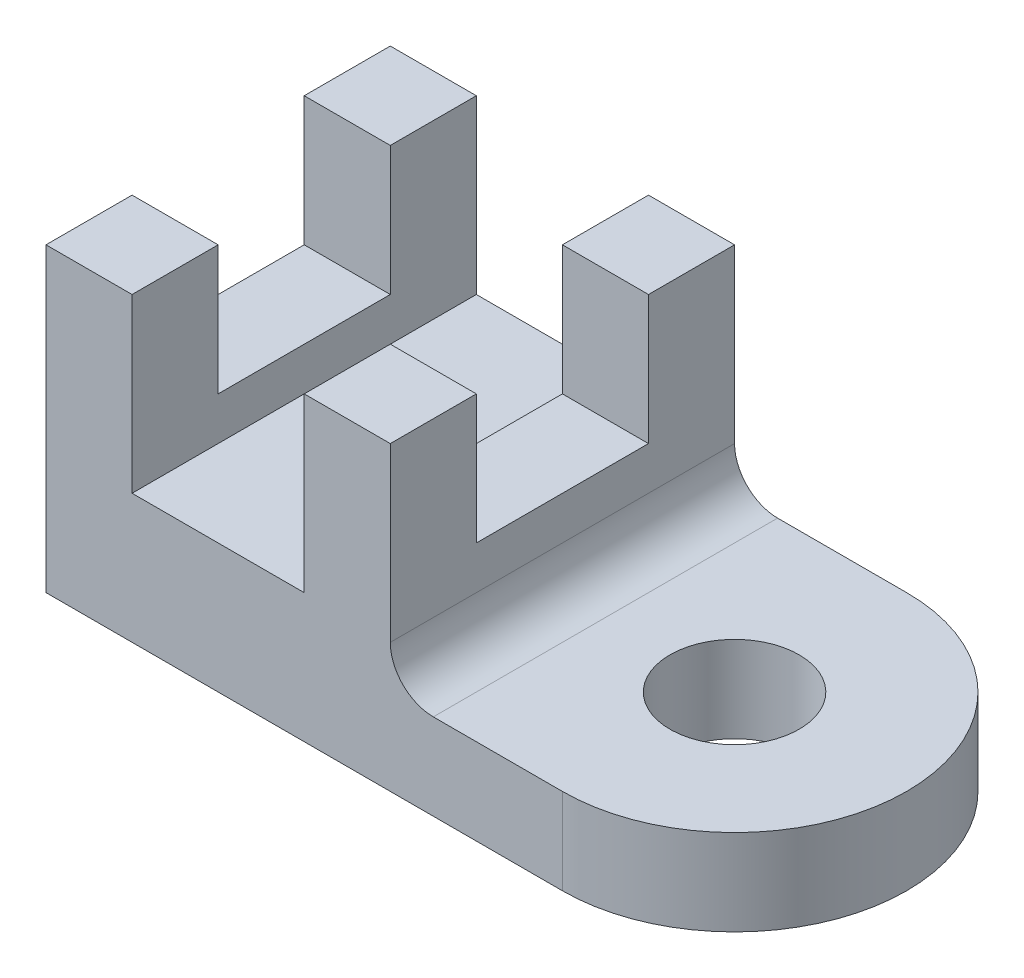
ISO-10303-21;
HEADER;
FILE_DESCRIPTION(('STEP AP214'),'2;1');
FILE_NAME('part.step','',(''),(''),'','','');
FILE_SCHEMA(('AUTOMOTIVE_DESIGN { 1 0 10303 214 1 1 1 1 }'));
ENDSEC;
DATA;
#1=APPLICATION_CONTEXT('core data for automotive mechanical design processes');
#2=APPLICATION_PROTOCOL_DEFINITION('international standard','automotive_design',2000,#1);
#3=PRODUCT_CONTEXT('',#1,'mechanical');
#4=PRODUCT('Part','Part','',(#3));
#5=PRODUCT_RELATED_PRODUCT_CATEGORY('part','',(#4));
#6=PRODUCT_DEFINITION_FORMATION('','',#4);
#7=PRODUCT_DEFINITION_CONTEXT('part definition',#1,'design');
#8=PRODUCT_DEFINITION('design','',#6,#7);
#9=PRODUCT_DEFINITION_SHAPE('','',#8);
#10=(LENGTH_UNIT() NAMED_UNIT(*) SI_UNIT(.MILLI.,.METRE.));
#11=(NAMED_UNIT(*) PLANE_ANGLE_UNIT() SI_UNIT($,.RADIAN.));
#12=(NAMED_UNIT(*) SI_UNIT($,.STERADIAN.) SOLID_ANGLE_UNIT());
#13=UNCERTAINTY_MEASURE_WITH_UNIT(LENGTH_MEASURE(1.E-05),#10,'distance_accuracy_value','');
#14=(GEOMETRIC_REPRESENTATION_CONTEXT(3) GLOBAL_UNCERTAINTY_ASSIGNED_CONTEXT((#13)) GLOBAL_UNIT_ASSIGNED_CONTEXT((#10,
#11,#12)) REPRESENTATION_CONTEXT('',''));
#15=CARTESIAN_POINT('',(0.,0.,0.));
#16=DIRECTION('',(0.,0.,1.));
#17=DIRECTION('',(1.,0.,0.));
#18=AXIS2_PLACEMENT_3D('',#15,#16,#17);
#19=CARTESIAN_POINT('',(50.8,44.45,25.4));
#20=DIRECTION('',(0.,-1.,0.));
#21=DIRECTION('',(1.,0.,0.));
#22=AXIS2_PLACEMENT_3D('',#19,#20,#21);
#23=PLANE('',#22);
#24=DIRECTION('',(0.,0.,-1.));
#25=VECTOR('',#24,1.);
#26=CARTESIAN_POINT('',(50.8,44.45,25.4));
#27=LINE('',#26,#25);
#28=CARTESIAN_POINT('',(50.8,44.45,25.4));
#29=VERTEX_POINT('',#28);
#30=CARTESIAN_POINT('',(50.8,44.45,12.7));
#31=VERTEX_POINT('',#30);
#32=EDGE_CURVE('E301',#29,#31,#27,.T.);
#33=ORIENTED_EDGE('',*,*,#32,.T.);
#34=DIRECTION('',(1.,0.,0.));
#35=VECTOR('',#34,1.);
#36=CARTESIAN_POINT('',(0.,44.45,12.7));
#37=LINE('',#36,#35);
#38=CARTESIAN_POINT('',(38.1,44.45,12.7));
#39=VERTEX_POINT('',#38);
#40=EDGE_CURVE('E208',#39,#31,#37,.T.);
#41=ORIENTED_EDGE('',*,*,#40,.F.);
#42=DIRECTION('',(0.,0.,-1.));
#43=VECTOR('',#42,1.);
#44=CARTESIAN_POINT('',(38.1,44.45,25.4));
#45=LINE('',#44,#43);
#46=CARTESIAN_POINT('',(38.1,44.45,25.4));
#47=VERTEX_POINT('',#46);
#48=EDGE_CURVE('E297',#47,#39,#45,.T.);
#49=ORIENTED_EDGE('',*,*,#48,.F.);
#50=DIRECTION('',(-1.,0.,0.));
#51=VECTOR('',#50,1.);
#52=CARTESIAN_POINT('',(50.8,44.45,25.4));
#53=LINE('',#52,#51);
#54=EDGE_CURVE('E251',#29,#47,#53,.T.);
#55=ORIENTED_EDGE('',*,*,#54,.F.);
#56=EDGE_LOOP('',(#33,#41,#49,#55));
#57=FACE_BOUND('',#56,.T.);
#58=ADVANCED_FACE('F37',(#57),#23,.F.);
#59=CARTESIAN_POINT('',(12.7,44.45,25.4));
#60=DIRECTION('',(0.,-1.,0.));
#61=DIRECTION('',(0.,0.,-1.));
#62=AXIS2_PLACEMENT_3D('',#59,#60,#61);
#63=PLANE('',#62);
#64=DIRECTION('',(0.,0.,-1.));
#65=VECTOR('',#64,1.);
#66=CARTESIAN_POINT('',(12.7,44.45,25.4));
#67=LINE('',#66,#65);
#68=CARTESIAN_POINT('',(12.7,44.45,25.4));
#69=VERTEX_POINT('',#68);
#70=CARTESIAN_POINT('',(12.7,44.45,12.7));
#71=VERTEX_POINT('',#70);
#72=EDGE_CURVE('E287',#69,#71,#67,.T.);
#73=ORIENTED_EDGE('',*,*,#72,.T.);
#74=CARTESIAN_POINT('',(0.,44.45,12.7));
#75=VERTEX_POINT('',#74);
#76=EDGE_CURVE('E205',#75,#71,#37,.T.);
#77=ORIENTED_EDGE('',*,*,#76,.F.);
#78=DIRECTION('',(0.,0.,-1.));
#79=VECTOR('',#78,1.);
#80=CARTESIAN_POINT('',(0.,44.45,25.4));
#81=LINE('',#80,#79);
#82=CARTESIAN_POINT('',(0.,44.45,25.4));
#83=VERTEX_POINT('',#82);
#84=EDGE_CURVE('E193',#83,#75,#81,.T.);
#85=ORIENTED_EDGE('',*,*,#84,.F.);
#86=DIRECTION('',(-1.,0.,0.));
#87=VECTOR('',#86,1.);
#88=CARTESIAN_POINT('',(12.7,44.45,25.4));
#89=LINE('',#88,#87);
#90=EDGE_CURVE('E259',#69,#83,#89,.T.);
#91=ORIENTED_EDGE('',*,*,#90,.F.);
#92=EDGE_LOOP('',(#73,#77,#85,#91));
#93=FACE_BOUND('',#92,.T.);
#94=ADVANCED_FACE('F356',(#93),#63,.F.);
#95=CARTESIAN_POINT('',(0.,44.45,25.4));
#96=DIRECTION('',(1.,0.,0.));
#97=DIRECTION('',(0.,1.,0.));
#98=AXIS2_PLACEMENT_3D('',#95,#96,#97);
#99=PLANE('',#98);
#100=ORIENTED_EDGE('',*,*,#84,.T.);
#101=DIRECTION('',(0.,-1.,0.));
#102=VECTOR('',#101,1.);
#103=CARTESIAN_POINT('',(0.,44.45,12.7));
#104=LINE('',#103,#102);
#105=CARTESIAN_POINT('',(0.,25.4,12.7));
#106=VERTEX_POINT('',#105);
#107=EDGE_CURVE('E170',#75,#106,#104,.T.);
#108=ORIENTED_EDGE('',*,*,#107,.T.);
#109=DIRECTION('',(0.,0.,-1.));
#110=VECTOR('',#109,1.);
#111=CARTESIAN_POINT('',(0.,25.4,12.7));
#112=LINE('',#111,#110);
#113=CARTESIAN_POINT('',(0.,25.4,-12.7));
#114=VERTEX_POINT('',#113);
#115=EDGE_CURVE('E180',#106,#114,#112,.T.);
#116=ORIENTED_EDGE('',*,*,#115,.T.);
#117=DIRECTION('',(0.,1.,0.));
#118=VECTOR('',#117,1.);
#119=CARTESIAN_POINT('',(0.,44.45,-12.7));
#120=LINE('',#119,#118);
#121=CARTESIAN_POINT('',(0.,44.45,-12.7));
#122=VERTEX_POINT('',#121);
#123=EDGE_CURVE('E187',#114,#122,#120,.T.);
#124=ORIENTED_EDGE('',*,*,#123,.T.);
#125=CARTESIAN_POINT('',(0.,44.45,-25.4));
#126=VERTEX_POINT('',#125);
#127=EDGE_CURVE('E261',#122,#126,#81,.T.);
#128=ORIENTED_EDGE('',*,*,#127,.T.);
#129=DIRECTION('',(0.,-1.,0.));
#130=VECTOR('',#129,1.);
#131=CARTESIAN_POINT('',(0.,44.45,-25.4));
#132=LINE('',#131,#130);
#133=CARTESIAN_POINT('',(0.,0.,-25.4));
#134=VERTEX_POINT('',#133);
#135=EDGE_CURVE('E238',#126,#134,#132,.T.);
#136=ORIENTED_EDGE('',*,*,#135,.T.);
#137=DIRECTION('',(0.,0.,-1.));
#138=VECTOR('',#137,1.);
#139=CARTESIAN_POINT('',(0.,0.,25.4));
#140=LINE('',#139,#138);
#141=CARTESIAN_POINT('',(0.,0.,25.4));
#142=VERTEX_POINT('',#141);
#143=EDGE_CURVE('E304',#142,#134,#140,.T.);
#144=ORIENTED_EDGE('',*,*,#143,.F.);
#145=DIRECTION('',(0.,-1.,0.));
#146=VECTOR('',#145,1.);
#147=CARTESIAN_POINT('',(0.,44.45,25.4));
#148=LINE('',#147,#146);
#149=EDGE_CURVE('E239',#83,#142,#148,.T.);
#150=ORIENTED_EDGE('',*,*,#149,.F.);
#151=EDGE_LOOP('',(#100,#108,#116,#124,#128,#136,#144,#150));
#152=FACE_BOUND('',#151,.T.);
#153=ADVANCED_FACE('F190',(#152),#99,.F.);
#154=CARTESIAN_POINT('',(0.,0.,25.4));
#155=DIRECTION('',(0.,1.,0.));
#156=DIRECTION('',(0.,0.,1.));
#157=AXIS2_PLACEMENT_3D('',#154,#155,#156);
#158=PLANE('',#157);
#159=CARTESIAN_POINT('',(76.2,0.,0.));
#160=DIRECTION('',(0.,1.,0.));
#161=DIRECTION('',(-1.,0.,0.));
#162=AXIS2_PLACEMENT_3D('',#159,#160,#161);
#163=CIRCLE('',#162,9.52500000000001);
#164=CARTESIAN_POINT('',(66.675,0.,0.));
#165=VERTEX_POINT('',#164);
#166=EDGE_CURVE('E227',#165,#165,#163,.T.);
#167=ORIENTED_EDGE('',*,*,#166,.T.);
#168=EDGE_LOOP('',(#167));
#169=FACE_BOUND('',#168,.T.);
#170=DIRECTION('',(1.,0.,0.));
#171=VECTOR('',#170,1.);
#172=CARTESIAN_POINT('',(0.,0.,-25.4));
#173=LINE('',#172,#171);
#174=CARTESIAN_POINT('',(76.2,0.,-25.4));
#175=VERTEX_POINT('',#174);
#176=EDGE_CURVE('E264',#134,#175,#173,.T.);
#177=ORIENTED_EDGE('',*,*,#176,.T.);
#178=CARTESIAN_POINT('',(76.2,0.,0.));
#179=DIRECTION('',(0.,-1.,0.));
#180=DIRECTION('',(0.,0.,-1.));
#181=AXIS2_PLACEMENT_3D('',#178,#179,#180);
#182=CIRCLE('',#181,25.4);
#183=CARTESIAN_POINT('',(76.2,0.,25.4));
#184=VERTEX_POINT('',#183);
#185=EDGE_CURVE('E230',#175,#184,#182,.T.);
#186=ORIENTED_EDGE('',*,*,#185,.T.);
#187=DIRECTION('',(1.,0.,0.));
#188=VECTOR('',#187,1.);
#189=CARTESIAN_POINT('',(0.,0.,25.4));
#190=LINE('',#189,#188);
#191=EDGE_CURVE('E242',#142,#184,#190,.T.);
#192=ORIENTED_EDGE('',*,*,#191,.F.);
#193=ORIENTED_EDGE('',*,*,#143,.T.);
#194=EDGE_LOOP('',(#177,#186,#192,#193));
#195=FACE_BOUND('',#194,.T.);
#196=ADVANCED_FACE('F378',(#169,#195),#158,.F.);
#197=CARTESIAN_POINT('',(76.2,12.7,25.4));
#198=DIRECTION('',(0.,-1.,0.));
#199=DIRECTION('',(1.,0.,0.));
#200=AXIS2_PLACEMENT_3D('',#197,#198,#199);
#201=PLANE('',#200);
#202=CARTESIAN_POINT('',(76.2,12.7,0.));
#203=DIRECTION('',(0.,1.,0.));
#204=DIRECTION('',(-1.,0.,0.));
#205=AXIS2_PLACEMENT_3D('',#202,#203,#204);
#206=CIRCLE('',#205,9.52500000000001);
#207=CARTESIAN_POINT('',(66.675,12.7,0.));
#208=VERTEX_POINT('',#207);
#209=EDGE_CURVE('E226',#208,#208,#206,.T.);
#210=ORIENTED_EDGE('',*,*,#209,.F.);
#211=EDGE_LOOP('',(#210));
#212=FACE_BOUND('',#211,.T.);
#213=DIRECTION('',(-1.,0.,0.));
#214=VECTOR('',#213,1.);
#215=CARTESIAN_POINT('',(76.2,12.7,-25.4));
#216=LINE('',#215,#214);
#217=CARTESIAN_POINT('',(76.2,12.7,-25.4));
#218=VERTEX_POINT('',#217);
#219=CARTESIAN_POINT('',(57.15,12.7,-25.4));
#220=VERTEX_POINT('',#219);
#221=EDGE_CURVE('E269',#218,#220,#216,.T.);
#222=ORIENTED_EDGE('',*,*,#221,.T.);
#223=DIRECTION('',(0.,0.,-1.));
#224=VECTOR('',#223,1.);
#225=CARTESIAN_POINT('',(57.15,12.7,25.4));
#226=LINE('',#225,#224);
#227=CARTESIAN_POINT('',(57.15,12.7,25.4));
#228=VERTEX_POINT('',#227);
#229=EDGE_CURVE('E52',#220,#228,#226,.F.);
#230=ORIENTED_EDGE('',*,*,#229,.T.);
#231=DIRECTION('',(-1.,0.,0.));
#232=VECTOR('',#231,1.);
#233=CARTESIAN_POINT('',(76.2,12.7,25.4));
#234=LINE('',#233,#232);
#235=CARTESIAN_POINT('',(76.2,12.7,25.4));
#236=VERTEX_POINT('',#235);
#237=EDGE_CURVE('E247',#236,#228,#234,.T.);
#238=ORIENTED_EDGE('',*,*,#237,.F.);
#239=CARTESIAN_POINT('',(76.2,12.7,0.));
#240=DIRECTION('',(0.,-1.,0.));
#241=DIRECTION('',(1.,0.,0.));
#242=AXIS2_PLACEMENT_3D('',#239,#240,#241);
#243=CIRCLE('',#242,25.4);
#244=EDGE_CURVE('E235',#236,#218,#243,.F.);
#245=ORIENTED_EDGE('',*,*,#244,.T.);
#246=EDGE_LOOP('',(#222,#230,#238,#245));
#247=FACE_BOUND('',#246,.T.);
#248=ADVANCED_FACE('F374',(#212,#247),#201,.F.);
#249=CARTESIAN_POINT('',(50.8,12.7,25.4));
#250=DIRECTION('',(-1.,0.,0.));
#251=DIRECTION('',(0.,0.,1.));
#252=AXIS2_PLACEMENT_3D('',#249,#250,#251);
#253=PLANE('',#252);
#254=DIRECTION('',(0.,1.,0.));
#255=VECTOR('',#254,1.);
#256=CARTESIAN_POINT('',(50.8,12.7,25.4));
#257=LINE('',#256,#255);
#258=CARTESIAN_POINT('',(50.8,19.05,25.4));
#259=VERTEX_POINT('',#258);
#260=EDGE_CURVE('E249',#259,#29,#257,.T.);
#261=ORIENTED_EDGE('',*,*,#260,.F.);
#262=DIRECTION('',(0.,0.,-1.));
#263=VECTOR('',#262,1.);
#264=CARTESIAN_POINT('',(50.8,19.05,-25.4));
#265=LINE('',#264,#263);
#266=CARTESIAN_POINT('',(50.8,19.05,-25.4));
#267=VERTEX_POINT('',#266);
#268=EDGE_CURVE('E309',#259,#267,#265,.T.);
#269=ORIENTED_EDGE('',*,*,#268,.T.);
#270=DIRECTION('',(0.,1.,0.));
#271=VECTOR('',#270,1.);
#272=CARTESIAN_POINT('',(50.8,12.7,-25.4));
#273=LINE('',#272,#271);
#274=CARTESIAN_POINT('',(50.8,44.45,-25.4));
#275=VERTEX_POINT('',#274);
#276=EDGE_CURVE('E271',#267,#275,#273,.T.);
#277=ORIENTED_EDGE('',*,*,#276,.T.);
#278=CARTESIAN_POINT('',(50.8,44.45,-12.7));
#279=VERTEX_POINT('',#278);
#280=EDGE_CURVE('E300',#279,#275,#27,.T.);
#281=ORIENTED_EDGE('',*,*,#280,.F.);
#282=DIRECTION('',(0.,1.,0.));
#283=VECTOR('',#282,1.);
#284=CARTESIAN_POINT('',(50.8,44.45,-12.7));
#285=LINE('',#284,#283);
#286=CARTESIAN_POINT('',(50.8,25.4,-12.7));
#287=VERTEX_POINT('',#286);
#288=EDGE_CURVE('E194',#287,#279,#285,.T.);
#289=ORIENTED_EDGE('',*,*,#288,.F.);
#290=DIRECTION('',(0.,0.,-1.));
#291=VECTOR('',#290,1.);
#292=CARTESIAN_POINT('',(50.8,25.4,12.7));
#293=LINE('',#292,#291);
#294=CARTESIAN_POINT('',(50.8,25.4,12.7));
#295=VERTEX_POINT('',#294);
#296=EDGE_CURVE('E196',#295,#287,#293,.T.);
#297=ORIENTED_EDGE('',*,*,#296,.F.);
#298=DIRECTION('',(0.,-1.,0.));
#299=VECTOR('',#298,1.);
#300=CARTESIAN_POINT('',(50.8,44.45,12.7));
#301=LINE('',#300,#299);
#302=EDGE_CURVE('E200',#31,#295,#301,.T.);
#303=ORIENTED_EDGE('',*,*,#302,.F.);
#304=ORIENTED_EDGE('',*,*,#32,.F.);
#305=EDGE_LOOP('',(#261,#269,#277,#281,#289,#297,#303,#304));
#306=FACE_BOUND('',#305,.T.);
#307=ADVANCED_FACE('F315',(#306),#253,.F.);
#308=CARTESIAN_POINT('',(38.1,44.45,-12.7));
#309=VERTEX_POINT('',#308);
#310=CARTESIAN_POINT('',(38.1,44.45,-25.4));
#311=VERTEX_POINT('',#310);
#312=EDGE_CURVE('E296',#309,#311,#45,.T.);
#313=ORIENTED_EDGE('',*,*,#312,.F.);
#314=DIRECTION('',(1.,0.,0.));
#315=VECTOR('',#314,1.);
#316=CARTESIAN_POINT('',(0.,44.45,-12.7));
#317=LINE('',#316,#315);
#318=EDGE_CURVE('E212',#309,#279,#317,.T.);
#319=ORIENTED_EDGE('',*,*,#318,.T.);
#320=ORIENTED_EDGE('',*,*,#280,.T.);
#321=DIRECTION('',(-1.,0.,0.));
#322=VECTOR('',#321,1.);
#323=CARTESIAN_POINT('',(50.8,44.45,-25.4));
#324=LINE('',#323,#322);
#325=EDGE_CURVE('E273',#275,#311,#324,.T.);
#326=ORIENTED_EDGE('',*,*,#325,.T.);
#327=EDGE_LOOP('',(#313,#319,#320,#326));
#328=FACE_BOUND('',#327,.T.);
#329=ADVANCED_FACE('F328',(#328),#23,.F.);
#330=CARTESIAN_POINT('',(38.1,44.45,25.4));
#331=DIRECTION('',(1.,0.,0.));
#332=DIRECTION('',(0.,0.,-1.));
#333=AXIS2_PLACEMENT_3D('',#330,#331,#332);
#334=PLANE('',#333);
#335=ORIENTED_EDGE('',*,*,#48,.T.);
#336=DIRECTION('',(0.,-1.,0.));
#337=VECTOR('',#336,1.);
#338=CARTESIAN_POINT('',(38.1,44.45,12.7));
#339=LINE('',#338,#337);
#340=CARTESIAN_POINT('',(38.1,25.4,12.7));
#341=VERTEX_POINT('',#340);
#342=EDGE_CURVE('E220',#39,#341,#339,.T.);
#343=ORIENTED_EDGE('',*,*,#342,.T.);
#344=DIRECTION('',(0.,0.,-1.));
#345=VECTOR('',#344,1.);
#346=CARTESIAN_POINT('',(38.1,25.4,25.4));
#347=LINE('',#346,#345);
#348=CARTESIAN_POINT('',(38.1,25.4,-12.7));
#349=VERTEX_POINT('',#348);
#350=EDGE_CURVE('E223',#341,#349,#347,.T.);
#351=ORIENTED_EDGE('',*,*,#350,.T.);
#352=DIRECTION('',(0.,1.,0.));
#353=VECTOR('',#352,1.);
#354=CARTESIAN_POINT('',(38.1,44.45,-12.7));
#355=LINE('',#354,#353);
#356=EDGE_CURVE('E216',#349,#309,#355,.T.);
#357=ORIENTED_EDGE('',*,*,#356,.T.);
#358=ORIENTED_EDGE('',*,*,#312,.T.);
#359=DIRECTION('',(0.,-1.,0.));
#360=VECTOR('',#359,1.);
#361=CARTESIAN_POINT('',(38.1,44.45,-25.4));
#362=LINE('',#361,#360);
#363=CARTESIAN_POINT('',(38.1,19.05,-25.4));
#364=VERTEX_POINT('',#363);
#365=EDGE_CURVE('E276',#311,#364,#362,.T.);
#366=ORIENTED_EDGE('',*,*,#365,.T.);
#367=DIRECTION('',(0.,0.,-1.));
#368=VECTOR('',#367,1.);
#369=CARTESIAN_POINT('',(38.1,19.05,25.4));
#370=LINE('',#369,#368);
#371=CARTESIAN_POINT('',(38.1,19.05,25.4));
#372=VERTEX_POINT('',#371);
#373=EDGE_CURVE('E293',#372,#364,#370,.T.);
#374=ORIENTED_EDGE('',*,*,#373,.F.);
#375=DIRECTION('',(0.,-1.,0.));
#376=VECTOR('',#375,1.);
#377=CARTESIAN_POINT('',(38.1,44.45,25.4));
#378=LINE('',#377,#376);
#379=EDGE_CURVE('E253',#47,#372,#378,.T.);
#380=ORIENTED_EDGE('',*,*,#379,.F.);
#381=EDGE_LOOP('',(#335,#343,#351,#357,#358,#366,#374,#380));
#382=FACE_BOUND('',#381,.T.);
#383=ADVANCED_FACE('F367',(#382),#334,.F.);
#384=CARTESIAN_POINT('',(38.1,19.05,25.4));
#385=DIRECTION('',(0.,-1.,0.));
#386=DIRECTION('',(1.,0.,0.));
#387=AXIS2_PLACEMENT_3D('',#384,#385,#386);
#388=PLANE('',#387);
#389=DIRECTION('',(-1.,0.,0.));
#390=VECTOR('',#389,1.);
#391=CARTESIAN_POINT('',(38.1,19.05,-25.4));
#392=LINE('',#391,#390);
#393=CARTESIAN_POINT('',(12.7,19.05,-25.4));
#394=VERTEX_POINT('',#393);
#395=EDGE_CURVE('E278',#364,#394,#392,.T.);
#396=ORIENTED_EDGE('',*,*,#395,.T.);
#397=DIRECTION('',(0.,0.,-1.));
#398=VECTOR('',#397,1.);
#399=CARTESIAN_POINT('',(12.7,19.05,25.4));
#400=LINE('',#399,#398);
#401=CARTESIAN_POINT('',(12.7,19.05,25.4));
#402=VERTEX_POINT('',#401);
#403=EDGE_CURVE('E290',#402,#394,#400,.T.);
#404=ORIENTED_EDGE('',*,*,#403,.F.);
#405=DIRECTION('',(-1.,0.,0.));
#406=VECTOR('',#405,1.);
#407=CARTESIAN_POINT('',(38.1,19.05,25.4));
#408=LINE('',#407,#406);
#409=EDGE_CURVE('E255',#372,#402,#408,.T.);
#410=ORIENTED_EDGE('',*,*,#409,.F.);
#411=ORIENTED_EDGE('',*,*,#373,.T.);
#412=EDGE_LOOP('',(#396,#404,#410,#411));
#413=FACE_BOUND('',#412,.T.);
#414=ADVANCED_FACE('F372',(#413),#388,.F.);
#415=CARTESIAN_POINT('',(12.7,19.05,25.4));
#416=DIRECTION('',(-1.,0.,0.));
#417=DIRECTION('',(0.,0.,1.));
#418=AXIS2_PLACEMENT_3D('',#415,#416,#417);
#419=PLANE('',#418);
#420=DIRECTION('',(0.,0.,1.));
#421=VECTOR('',#420,1.);
#422=CARTESIAN_POINT('',(12.7,25.4,25.4));
#423=LINE('',#422,#421);
#424=CARTESIAN_POINT('',(12.7,25.4,-12.7));
#425=VERTEX_POINT('',#424);
#426=CARTESIAN_POINT('',(12.7,25.4,12.7));
#427=VERTEX_POINT('',#426);
#428=EDGE_CURVE('E307',#425,#427,#423,.T.);
#429=ORIENTED_EDGE('',*,*,#428,.T.);
#430=DIRECTION('',(0.,1.,0.));
#431=VECTOR('',#430,1.);
#432=CARTESIAN_POINT('',(12.7,19.05,12.7));
#433=LINE('',#432,#431);
#434=EDGE_CURVE('E173',#427,#71,#433,.T.);
#435=ORIENTED_EDGE('',*,*,#434,.T.);
#436=ORIENTED_EDGE('',*,*,#72,.F.);
#437=DIRECTION('',(0.,1.,0.));
#438=VECTOR('',#437,1.);
#439=CARTESIAN_POINT('',(12.7,19.05,25.4));
#440=LINE('',#439,#438);
#441=EDGE_CURVE('E257',#402,#69,#440,.T.);
#442=ORIENTED_EDGE('',*,*,#441,.F.);
#443=ORIENTED_EDGE('',*,*,#403,.T.);
#444=DIRECTION('',(0.,1.,0.));
#445=VECTOR('',#444,1.);
#446=CARTESIAN_POINT('',(12.7,19.05,-25.4));
#447=LINE('',#446,#445);
#448=CARTESIAN_POINT('',(12.7,44.45,-25.4));
#449=VERTEX_POINT('',#448);
#450=EDGE_CURVE('E280',#394,#449,#447,.T.);
#451=ORIENTED_EDGE('',*,*,#450,.T.);
#452=CARTESIAN_POINT('',(12.7,44.45,-12.7));
#453=VERTEX_POINT('',#452);
#454=EDGE_CURVE('E286',#453,#449,#67,.T.);
#455=ORIENTED_EDGE('',*,*,#454,.F.);
#456=DIRECTION('',(0.,-1.,0.));
#457=VECTOR('',#456,1.);
#458=CARTESIAN_POINT('',(12.7,19.05,-12.7));
#459=LINE('',#458,#457);
#460=EDGE_CURVE('E207',#453,#425,#459,.T.);
#461=ORIENTED_EDGE('',*,*,#460,.T.);
#462=EDGE_LOOP('',(#429,#435,#436,#442,#443,#451,#455,#461));
#463=FACE_BOUND('',#462,.T.);
#464=ADVANCED_FACE('F499',(#463),#419,.F.);
#465=ORIENTED_EDGE('',*,*,#127,.F.);
#466=EDGE_CURVE('E209',#122,#453,#317,.T.);
#467=ORIENTED_EDGE('',*,*,#466,.T.);
#468=ORIENTED_EDGE('',*,*,#454,.T.);
#469=DIRECTION('',(-1.,0.,0.));
#470=VECTOR('',#469,1.);
#471=CARTESIAN_POINT('',(12.7,44.45,-25.4));
#472=LINE('',#471,#470);
#473=EDGE_CURVE('E243',#449,#126,#472,.T.);
#474=ORIENTED_EDGE('',*,*,#473,.T.);
#475=EDGE_LOOP('',(#465,#467,#468,#474));
#476=FACE_BOUND('',#475,.T.);
#477=ADVANCED_FACE('F363',(#476),#63,.F.);
#478=CARTESIAN_POINT('',(0.,0.,25.4));
#479=DIRECTION('',(0.,0.,1.));
#480=DIRECTION('',(1.,0.,0.));
#481=AXIS2_PLACEMENT_3D('',#478,#479,#480);
#482=PLANE('',#481);
#483=ORIENTED_EDGE('',*,*,#149,.T.);
#484=ORIENTED_EDGE('',*,*,#191,.T.);
#485=DIRECTION('',(0.,1.,0.));
#486=VECTOR('',#485,1.);
#487=CARTESIAN_POINT('',(76.2,0.,25.4));
#488=LINE('',#487,#486);
#489=EDGE_CURVE('E245',#184,#236,#488,.T.);
#490=ORIENTED_EDGE('',*,*,#489,.T.);
#491=ORIENTED_EDGE('',*,*,#237,.T.);
#492=CARTESIAN_POINT('',(57.15,19.05,25.4));
#493=DIRECTION('',(0.,0.,1.));
#494=DIRECTION('',(1.,0.,0.));
#495=AXIS2_PLACEMENT_3D('',#492,#493,#494);
#496=CIRCLE('',#495,6.35);
#497=EDGE_CURVE('E11',#228,#259,#496,.F.);
#498=ORIENTED_EDGE('',*,*,#497,.T.);
#499=ORIENTED_EDGE('',*,*,#260,.T.);
#500=ORIENTED_EDGE('',*,*,#54,.T.);
#501=ORIENTED_EDGE('',*,*,#379,.T.);
#502=ORIENTED_EDGE('',*,*,#409,.T.);
#503=ORIENTED_EDGE('',*,*,#441,.T.);
#504=ORIENTED_EDGE('',*,*,#90,.T.);
#505=EDGE_LOOP('',(#483,#484,#490,#491,#498,#499,#500,#501,#502,#503,#504));
#506=FACE_BOUND('',#505,.T.);
#507=ADVANCED_FACE('F347',(#506),#482,.T.);
#508=CARTESIAN_POINT('',(0.,0.,-25.4));
#509=DIRECTION('',(0.,0.,1.));
#510=DIRECTION('',(1.,0.,0.));
#511=AXIS2_PLACEMENT_3D('',#508,#509,#510);
#512=PLANE('',#511);
#513=ORIENTED_EDGE('',*,*,#135,.F.);
#514=ORIENTED_EDGE('',*,*,#473,.F.);
#515=ORIENTED_EDGE('',*,*,#450,.F.);
#516=ORIENTED_EDGE('',*,*,#395,.F.);
#517=ORIENTED_EDGE('',*,*,#365,.F.);
#518=ORIENTED_EDGE('',*,*,#325,.F.);
#519=ORIENTED_EDGE('',*,*,#276,.F.);
#520=CARTESIAN_POINT('',(57.15,19.05,-25.4));
#521=DIRECTION('',(0.,0.,1.));
#522=DIRECTION('',(1.,0.,0.));
#523=AXIS2_PLACEMENT_3D('',#520,#521,#522);
#524=CIRCLE('',#523,6.35);
#525=EDGE_CURVE('E45',#267,#220,#524,.T.);
#526=ORIENTED_EDGE('',*,*,#525,.T.);
#527=ORIENTED_EDGE('',*,*,#221,.F.);
#528=DIRECTION('',(0.,1.,0.));
#529=VECTOR('',#528,1.);
#530=CARTESIAN_POINT('',(76.2,0.,-25.4));
#531=LINE('',#530,#529);
#532=EDGE_CURVE('E266',#175,#218,#531,.T.);
#533=ORIENTED_EDGE('',*,*,#532,.F.);
#534=ORIENTED_EDGE('',*,*,#176,.F.);
#535=EDGE_LOOP('',(#513,#514,#515,#516,#517,#518,#519,#526,#527,#533,#534));
#536=FACE_BOUND('',#535,.T.);
#537=ADVANCED_FACE('F323',(#536),#512,.F.);
#538=CARTESIAN_POINT('',(76.2,84.5420489685532,0.));
#539=DIRECTION('',(0.,-1.,0.));
#540=DIRECTION('',(0.,0.,-1.));
#541=AXIS2_PLACEMENT_3D('',#538,#539,#540);
#542=CYLINDRICAL_SURFACE('',#541,25.4);
#543=ORIENTED_EDGE('',*,*,#244,.F.);
#544=ORIENTED_EDGE('',*,*,#489,.F.);
#545=ORIENTED_EDGE('',*,*,#185,.F.);
#546=ORIENTED_EDGE('',*,*,#532,.T.);
#547=EDGE_LOOP('',(#543,#544,#545,#546));
#548=FACE_BOUND('',#547,.T.);
#549=ADVANCED_FACE('F428',(#548),#542,.T.);
#550=CARTESIAN_POINT('',(76.2,0.,0.));
#551=DIRECTION('',(0.,1.,0.));
#552=DIRECTION('',(-1.,0.,0.));
#553=AXIS2_PLACEMENT_3D('',#550,#551,#552);
#554=CYLINDRICAL_SURFACE('',#553,9.52500000000001);
#555=ORIENTED_EDGE('',*,*,#166,.F.);
#556=EDGE_LOOP('',(#555));
#557=FACE_BOUND('',#556,.T.);
#558=ORIENTED_EDGE('',*,*,#209,.T.);
#559=EDGE_LOOP('',(#558));
#560=FACE_BOUND('',#559,.T.);
#561=ADVANCED_FACE('F472',(#557,#560),#554,.F.);
#562=CARTESIAN_POINT('',(0.,44.45,12.7));
#563=DIRECTION('',(0.,0.,1.));
#564=DIRECTION('',(0.,-1.,0.));
#565=AXIS2_PLACEMENT_3D('',#562,#563,#564);
#566=PLANE('',#565);
#567=DIRECTION('',(1.,0.,0.));
#568=VECTOR('',#567,1.);
#569=CARTESIAN_POINT('',(0.,25.4,12.7));
#570=LINE('',#569,#568);
#571=EDGE_CURVE('E166',#106,#427,#570,.T.);
#572=ORIENTED_EDGE('',*,*,#571,.F.);
#573=ORIENTED_EDGE('',*,*,#107,.F.);
#574=ORIENTED_EDGE('',*,*,#76,.T.);
#575=ORIENTED_EDGE('',*,*,#434,.F.);
#576=EDGE_LOOP('',(#572,#573,#574,#575));
#577=FACE_BOUND('',#576,.T.);
#578=ADVANCED_FACE('F168',(#577),#566,.F.);
#579=CARTESIAN_POINT('',(0.,44.45,-12.7));
#580=DIRECTION('',(0.,0.,-1.));
#581=DIRECTION('',(0.,1.,0.));
#582=AXIS2_PLACEMENT_3D('',#579,#580,#581);
#583=PLANE('',#582);
#584=ORIENTED_EDGE('',*,*,#466,.F.);
#585=ORIENTED_EDGE('',*,*,#123,.F.);
#586=DIRECTION('',(1.,0.,0.));
#587=VECTOR('',#586,1.);
#588=CARTESIAN_POINT('',(0.,25.4,-12.7));
#589=LINE('',#588,#587);
#590=EDGE_CURVE('E183',#114,#425,#589,.T.);
#591=ORIENTED_EDGE('',*,*,#590,.T.);
#592=ORIENTED_EDGE('',*,*,#460,.F.);
#593=EDGE_LOOP('',(#584,#585,#591,#592));
#594=FACE_BOUND('',#593,.T.);
#595=ADVANCED_FACE('F354',(#594),#583,.F.);
#596=CARTESIAN_POINT('',(0.,25.4,12.7));
#597=DIRECTION('',(0.,-1.,0.));
#598=DIRECTION('',(0.,0.,-1.));
#599=AXIS2_PLACEMENT_3D('',#596,#597,#598);
#600=PLANE('',#599);
#601=ORIENTED_EDGE('',*,*,#590,.F.);
#602=ORIENTED_EDGE('',*,*,#115,.F.);
#603=ORIENTED_EDGE('',*,*,#571,.T.);
#604=ORIENTED_EDGE('',*,*,#428,.F.);
#605=EDGE_LOOP('',(#601,#602,#603,#604));
#606=FACE_BOUND('',#605,.T.);
#607=ADVANCED_FACE('F181',(#606),#600,.F.);
#608=EDGE_CURVE('E177',#341,#295,#570,.T.);
#609=ORIENTED_EDGE('',*,*,#608,.T.);
#610=ORIENTED_EDGE('',*,*,#296,.T.);
#611=EDGE_CURVE('E176',#349,#287,#589,.T.);
#612=ORIENTED_EDGE('',*,*,#611,.F.);
#613=ORIENTED_EDGE('',*,*,#350,.F.);
#614=EDGE_LOOP('',(#609,#610,#612,#613));
#615=FACE_BOUND('',#614,.T.);
#616=ADVANCED_FACE('F337',(#615),#600,.F.);
#617=ORIENTED_EDGE('',*,*,#40,.T.);
#618=ORIENTED_EDGE('',*,*,#302,.T.);
#619=ORIENTED_EDGE('',*,*,#608,.F.);
#620=ORIENTED_EDGE('',*,*,#342,.F.);
#621=EDGE_LOOP('',(#617,#618,#619,#620));
#622=FACE_BOUND('',#621,.T.);
#623=ADVANCED_FACE('F340',(#622),#566,.F.);
#624=ORIENTED_EDGE('',*,*,#611,.T.);
#625=ORIENTED_EDGE('',*,*,#288,.T.);
#626=ORIENTED_EDGE('',*,*,#318,.F.);
#627=ORIENTED_EDGE('',*,*,#356,.F.);
#628=EDGE_LOOP('',(#624,#625,#626,#627));
#629=FACE_BOUND('',#628,.T.);
#630=ADVANCED_FACE('F334',(#629),#583,.F.);
#631=CARTESIAN_POINT('',(57.15,19.05,25.4));
#632=DIRECTION('',(0.,0.,1.));
#633=DIRECTION('',(1.,0.,0.));
#634=AXIS2_PLACEMENT_3D('',#631,#632,#633);
#635=CYLINDRICAL_SURFACE('',#634,6.35);
#636=ORIENTED_EDGE('',*,*,#497,.F.);
#637=ORIENTED_EDGE('',*,*,#229,.F.);
#638=ORIENTED_EDGE('',*,*,#525,.F.);
#639=ORIENTED_EDGE('',*,*,#268,.F.);
#640=EDGE_LOOP('',(#636,#637,#638,#639));
#641=FACE_BOUND('',#640,.T.);
#642=ADVANCED_FACE('F39',(#641),#635,.F.);
#643=CLOSED_SHELL('',(#58,#94,#153,#196,#248,#307,#329,#383,#414,#464,#477,#507,#537,#549,#561,
#578,#595,#607,#616,#623,#630,#642));
#644=MANIFOLD_SOLID_BREP('B2',#643);
#645=ADVANCED_BREP_SHAPE_REPRESENTATION('',(#18,#644),#14);
#646=SHAPE_DEFINITION_REPRESENTATION(#9,#645);
ENDSEC;
END-ISO-10303-21;
